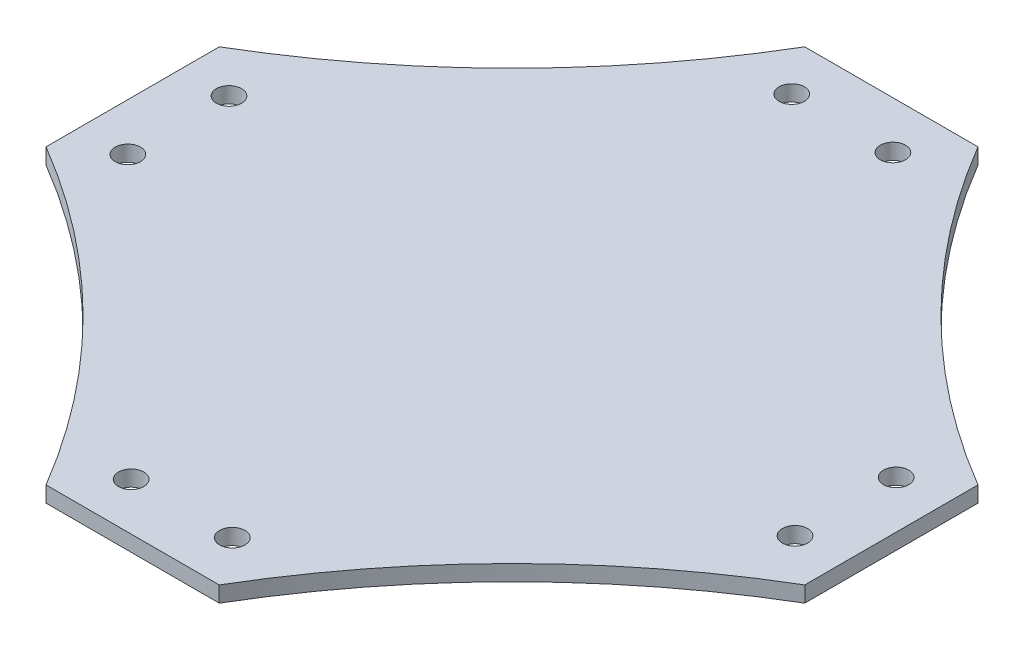
ISO-10303-21;
HEADER;
FILE_DESCRIPTION(('STEP AP214'),'2;1');
FILE_NAME('part.step','',(''),(''),'','','');
FILE_SCHEMA(('AUTOMOTIVE_DESIGN { 1 0 10303 214 1 1 1 1 }'));
ENDSEC;
DATA;
#1=APPLICATION_CONTEXT('core data for automotive mechanical design processes');
#2=APPLICATION_PROTOCOL_DEFINITION('international standard','automotive_design',2000,#1);
#3=PRODUCT_CONTEXT('',#1,'mechanical');
#4=PRODUCT('Part','Part','',(#3));
#5=PRODUCT_RELATED_PRODUCT_CATEGORY('part','',(#4));
#6=PRODUCT_DEFINITION_FORMATION('','',#4);
#7=PRODUCT_DEFINITION_CONTEXT('part definition',#1,'design');
#8=PRODUCT_DEFINITION('design','',#6,#7);
#9=PRODUCT_DEFINITION_SHAPE('','',#8);
#10=(LENGTH_UNIT() NAMED_UNIT(*) SI_UNIT(.MILLI.,.METRE.));
#11=(NAMED_UNIT(*) PLANE_ANGLE_UNIT() SI_UNIT($,.RADIAN.));
#12=(NAMED_UNIT(*) SI_UNIT($,.STERADIAN.) SOLID_ANGLE_UNIT());
#13=UNCERTAINTY_MEASURE_WITH_UNIT(LENGTH_MEASURE(1.E-05),#10,'distance_accuracy_value','');
#14=(GEOMETRIC_REPRESENTATION_CONTEXT(3) GLOBAL_UNCERTAINTY_ASSIGNED_CONTEXT((#13)) GLOBAL_UNIT_ASSIGNED_CONTEXT((#10,
#11,#12)) REPRESENTATION_CONTEXT('',''));
#15=CARTESIAN_POINT('',(0.,0.,0.));
#16=DIRECTION('',(0.,0.,1.));
#17=DIRECTION('',(1.,0.,0.));
#18=AXIS2_PLACEMENT_3D('',#15,#16,#17);
#19=CARTESIAN_POINT('',(126.747724256716,2.5,-126.747724256714));
#20=DIRECTION('',(0.,-1.,0.));
#21=DIRECTION('',(0.,0.,-1.));
#22=AXIS2_PLACEMENT_3D('',#19,#20,#21);
#23=CYLINDRICAL_SURFACE('',#22,131.282316604609);
#24=CARTESIAN_POINT('',(126.747724256716,0.,-126.747724256714));
#25=DIRECTION('',(0.,-1.,0.));
#26=DIRECTION('',(0.,0.,-1.));
#27=AXIS2_PLACEMENT_3D('',#24,#25,#26);
#28=CIRCLE('',#27,131.282316604609);
#29=CARTESIAN_POINT('',(60.,0.,-13.6999999999998));
#30=VERTEX_POINT('',#29);
#31=CARTESIAN_POINT('',(13.7,0.,-60.));
#32=VERTEX_POINT('',#31);
#33=EDGE_CURVE('E133',#30,#32,#28,.T.);
#34=ORIENTED_EDGE('',*,*,#33,.T.);
#35=DIRECTION('',(0.,-1.,0.));
#36=VECTOR('',#35,1.);
#37=CARTESIAN_POINT('',(13.7,2.5,-60.));
#38=LINE('',#37,#36);
#39=CARTESIAN_POINT('',(13.7,2.5,-60.));
#40=VERTEX_POINT('',#39);
#41=EDGE_CURVE('E11',#40,#32,#38,.T.);
#42=ORIENTED_EDGE('',*,*,#41,.F.);
#43=CARTESIAN_POINT('',(126.747724256716,2.5,-126.747724256714));
#44=DIRECTION('',(0.,-1.,0.));
#45=DIRECTION('',(0.,0.,-1.));
#46=AXIS2_PLACEMENT_3D('',#43,#44,#45);
#47=CIRCLE('',#46,131.282316604609);
#48=CARTESIAN_POINT('',(60.,2.5,-13.6999999999998));
#49=VERTEX_POINT('',#48);
#50=EDGE_CURVE('E148',#49,#40,#47,.T.);
#51=ORIENTED_EDGE('',*,*,#50,.F.);
#52=DIRECTION('',(0.,-1.,0.));
#53=VECTOR('',#52,1.);
#54=CARTESIAN_POINT('',(60.,2.5,-13.6999999999998));
#55=LINE('',#54,#53);
#56=EDGE_CURVE('E129',#49,#30,#55,.T.);
#57=ORIENTED_EDGE('',*,*,#56,.T.);
#58=EDGE_LOOP('',(#34,#42,#51,#57));
#59=FACE_BOUND('',#58,.T.);
#60=ADVANCED_FACE('F37',(#59),#23,.F.);
#61=CARTESIAN_POINT('',(-13.7,2.5,-60.));
#62=DIRECTION('',(0.,0.,1.));
#63=DIRECTION('',(1.,0.,0.));
#64=AXIS2_PLACEMENT_3D('',#61,#62,#63);
#65=PLANE('',#64);
#66=DIRECTION('',(-1.,0.,0.));
#67=VECTOR('',#66,1.);
#68=CARTESIAN_POINT('',(-13.7,0.,-60.));
#69=LINE('',#68,#67);
#70=CARTESIAN_POINT('',(-13.7,0.,-60.));
#71=VERTEX_POINT('',#70);
#72=EDGE_CURVE('E136',#32,#71,#69,.T.);
#73=ORIENTED_EDGE('',*,*,#72,.T.);
#74=DIRECTION('',(0.,-1.,0.));
#75=VECTOR('',#74,1.);
#76=CARTESIAN_POINT('',(-13.7,2.5,-60.));
#77=LINE('',#76,#75);
#78=CARTESIAN_POINT('',(-13.7,2.5,-60.));
#79=VERTEX_POINT('',#78);
#80=EDGE_CURVE('E45',#79,#71,#77,.T.);
#81=ORIENTED_EDGE('',*,*,#80,.F.);
#82=DIRECTION('',(-1.,0.,0.));
#83=VECTOR('',#82,1.);
#84=CARTESIAN_POINT('',(-13.7,2.5,-60.));
#85=LINE('',#84,#83);
#86=EDGE_CURVE('E96',#40,#79,#85,.T.);
#87=ORIENTED_EDGE('',*,*,#86,.F.);
#88=ORIENTED_EDGE('',*,*,#41,.T.);
#89=EDGE_LOOP('',(#73,#81,#87,#88));
#90=FACE_BOUND('',#89,.T.);
#91=ADVANCED_FACE('F265',(#90),#65,.F.);
#92=CARTESIAN_POINT('',(-126.747724256714,2.5,-126.747724256716));
#93=DIRECTION('',(0.,-1.,0.));
#94=DIRECTION('',(0.,0.,-1.));
#95=AXIS2_PLACEMENT_3D('',#92,#93,#94);
#96=CYLINDRICAL_SURFACE('',#95,131.282316604609);
#97=CARTESIAN_POINT('',(-126.747724256714,0.,-126.747724256716));
#98=DIRECTION('',(0.,-1.,0.));
#99=DIRECTION('',(0.,0.,-1.));
#100=AXIS2_PLACEMENT_3D('',#97,#98,#99);
#101=CIRCLE('',#100,131.282316604609);
#102=CARTESIAN_POINT('',(-59.9999999999999,0.,-13.7000000000006));
#103=VERTEX_POINT('',#102);
#104=EDGE_CURVE('E139',#71,#103,#101,.T.);
#105=ORIENTED_EDGE('',*,*,#104,.T.);
#106=DIRECTION('',(0.,-1.,0.));
#107=VECTOR('',#106,1.);
#108=CARTESIAN_POINT('',(-59.9999999999999,2.5,-13.7000000000006));
#109=LINE('',#108,#107);
#110=CARTESIAN_POINT('',(-59.9999999999999,2.5,-13.7000000000006));
#111=VERTEX_POINT('',#110);
#112=EDGE_CURVE('E155',#111,#103,#109,.T.);
#113=ORIENTED_EDGE('',*,*,#112,.F.);
#114=CARTESIAN_POINT('',(-126.747724256714,2.5,-126.747724256716));
#115=DIRECTION('',(0.,-1.,0.));
#116=DIRECTION('',(0.,0.,-1.));
#117=AXIS2_PLACEMENT_3D('',#114,#115,#116);
#118=CIRCLE('',#117,131.282316604609);
#119=EDGE_CURVE('E163',#79,#111,#118,.T.);
#120=ORIENTED_EDGE('',*,*,#119,.F.);
#121=ORIENTED_EDGE('',*,*,#80,.T.);
#122=EDGE_LOOP('',(#105,#113,#120,#121));
#123=FACE_BOUND('',#122,.T.);
#124=ADVANCED_FACE('F161',(#123),#96,.F.);
#125=CARTESIAN_POINT('',(-60.0000000000002,2.5,13.6999999999994));
#126=DIRECTION('',(1.,0.,0.));
#127=DIRECTION('',(0.,0.,-1.));
#128=AXIS2_PLACEMENT_3D('',#125,#126,#127);
#129=PLANE('',#128);
#130=DIRECTION('',(0.,0.,1.));
#131=VECTOR('',#130,1.);
#132=CARTESIAN_POINT('',(-60.0000000000002,0.,13.6999999999994));
#133=LINE('',#132,#131);
#134=CARTESIAN_POINT('',(-60.0000000000002,0.,13.6999999999994));
#135=VERTEX_POINT('',#134);
#136=EDGE_CURVE('E141',#103,#135,#133,.T.);
#137=ORIENTED_EDGE('',*,*,#136,.T.);
#138=DIRECTION('',(0.,-1.,0.));
#139=VECTOR('',#138,1.);
#140=CARTESIAN_POINT('',(-60.0000000000002,2.5,13.6999999999994));
#141=LINE('',#140,#139);
#142=CARTESIAN_POINT('',(-60.0000000000002,2.5,13.6999999999994));
#143=VERTEX_POINT('',#142);
#144=EDGE_CURVE('E152',#143,#135,#141,.T.);
#145=ORIENTED_EDGE('',*,*,#144,.F.);
#146=DIRECTION('',(0.,0.,1.));
#147=VECTOR('',#146,1.);
#148=CARTESIAN_POINT('',(-60.0000000000002,2.5,13.6999999999994));
#149=LINE('',#148,#147);
#150=EDGE_CURVE('E175',#111,#143,#149,.T.);
#151=ORIENTED_EDGE('',*,*,#150,.F.);
#152=ORIENTED_EDGE('',*,*,#112,.T.);
#153=EDGE_LOOP('',(#137,#145,#151,#152));
#154=FACE_BOUND('',#153,.T.);
#155=ADVANCED_FACE('F171',(#154),#129,.F.);
#156=CARTESIAN_POINT('',(-126.747724256717,2.5,126.747724256713));
#157=DIRECTION('',(0.,-1.,0.));
#158=DIRECTION('',(0.,0.,-1.));
#159=AXIS2_PLACEMENT_3D('',#156,#157,#158);
#160=CYLINDRICAL_SURFACE('',#159,131.282316604609);
#161=CARTESIAN_POINT('',(-126.747724256717,0.,126.747724256713));
#162=DIRECTION('',(0.,-1.,0.));
#163=DIRECTION('',(0.,0.,-1.));
#164=AXIS2_PLACEMENT_3D('',#161,#162,#163);
#165=CIRCLE('',#164,131.282316604609);
#166=CARTESIAN_POINT('',(-13.7000000000007,0.,60.0000000000001));
#167=VERTEX_POINT('',#166);
#168=EDGE_CURVE('E143',#135,#167,#165,.T.);
#169=ORIENTED_EDGE('',*,*,#168,.T.);
#170=DIRECTION('',(0.,-1.,0.));
#171=VECTOR('',#170,1.);
#172=CARTESIAN_POINT('',(-13.7000000000007,2.5,60.0000000000001));
#173=LINE('',#172,#171);
#174=CARTESIAN_POINT('',(-13.7000000000007,2.5,60.0000000000001));
#175=VERTEX_POINT('',#174);
#176=EDGE_CURVE('E124',#175,#167,#173,.T.);
#177=ORIENTED_EDGE('',*,*,#176,.F.);
#178=CARTESIAN_POINT('',(-126.747724256717,2.5,126.747724256713));
#179=DIRECTION('',(0.,-1.,0.));
#180=DIRECTION('',(0.,0.,-1.));
#181=AXIS2_PLACEMENT_3D('',#178,#179,#180);
#182=CIRCLE('',#181,131.282316604609);
#183=EDGE_CURVE('E115',#143,#175,#182,.T.);
#184=ORIENTED_EDGE('',*,*,#183,.F.);
#185=ORIENTED_EDGE('',*,*,#144,.T.);
#186=EDGE_LOOP('',(#169,#177,#184,#185));
#187=FACE_BOUND('',#186,.T.);
#188=ADVANCED_FACE('F174',(#187),#160,.F.);
#189=CARTESIAN_POINT('',(13.6999999999996,2.5,60.0000000000001));
#190=DIRECTION('',(0.,0.,-1.));
#191=DIRECTION('',(-1.,0.,0.));
#192=AXIS2_PLACEMENT_3D('',#189,#190,#191);
#193=PLANE('',#192);
#194=DIRECTION('',(1.,0.,0.));
#195=VECTOR('',#194,1.);
#196=CARTESIAN_POINT('',(13.6999999999996,0.,60.0000000000001));
#197=LINE('',#196,#195);
#198=CARTESIAN_POINT('',(13.6999999999996,0.,60.0000000000001));
#199=VERTEX_POINT('',#198);
#200=EDGE_CURVE('E123',#167,#199,#197,.T.);
#201=ORIENTED_EDGE('',*,*,#200,.T.);
#202=DIRECTION('',(0.,-1.,0.));
#203=VECTOR('',#202,1.);
#204=CARTESIAN_POINT('',(13.6999999999996,2.5,60.0000000000001));
#205=LINE('',#204,#203);
#206=CARTESIAN_POINT('',(13.6999999999996,2.5,60.0000000000001));
#207=VERTEX_POINT('',#206);
#208=EDGE_CURVE('E120',#207,#199,#205,.T.);
#209=ORIENTED_EDGE('',*,*,#208,.F.);
#210=DIRECTION('',(1.,0.,0.));
#211=VECTOR('',#210,1.);
#212=CARTESIAN_POINT('',(13.6999999999996,2.5,60.0000000000001));
#213=LINE('',#212,#211);
#214=EDGE_CURVE('E109',#175,#207,#213,.T.);
#215=ORIENTED_EDGE('',*,*,#214,.F.);
#216=ORIENTED_EDGE('',*,*,#176,.T.);
#217=EDGE_LOOP('',(#201,#209,#215,#216));
#218=FACE_BOUND('',#217,.T.);
#219=ADVANCED_FACE('F121',(#218),#193,.F.);
#220=CARTESIAN_POINT('',(126.747724256714,2.5,126.747724256717));
#221=DIRECTION('',(0.,-1.,0.));
#222=DIRECTION('',(0.,0.,-1.));
#223=AXIS2_PLACEMENT_3D('',#220,#221,#222);
#224=CYLINDRICAL_SURFACE('',#223,131.282316604609);
#225=CARTESIAN_POINT('',(126.747724256714,0.,126.747724256717));
#226=DIRECTION('',(0.,-1.,0.));
#227=DIRECTION('',(0.,0.,-1.));
#228=AXIS2_PLACEMENT_3D('',#225,#226,#227);
#229=CIRCLE('',#228,131.282316604609);
#230=CARTESIAN_POINT('',(60.0000000000001,0.,13.7000000000004));
#231=VERTEX_POINT('',#230);
#232=EDGE_CURVE('E82',#199,#231,#229,.T.);
#233=ORIENTED_EDGE('',*,*,#232,.T.);
#234=DIRECTION('',(0.,-1.,0.));
#235=VECTOR('',#234,1.);
#236=CARTESIAN_POINT('',(60.0000000000001,2.5,13.7000000000004));
#237=LINE('',#236,#235);
#238=CARTESIAN_POINT('',(60.0000000000001,2.5,13.7000000000004));
#239=VERTEX_POINT('',#238);
#240=EDGE_CURVE('E125',#239,#231,#237,.T.);
#241=ORIENTED_EDGE('',*,*,#240,.F.);
#242=CARTESIAN_POINT('',(126.747724256714,2.5,126.747724256717));
#243=DIRECTION('',(0.,-1.,0.));
#244=DIRECTION('',(0.,0.,-1.));
#245=AXIS2_PLACEMENT_3D('',#242,#243,#244);
#246=CIRCLE('',#245,131.282316604609);
#247=EDGE_CURVE('E113',#207,#239,#246,.T.);
#248=ORIENTED_EDGE('',*,*,#247,.F.);
#249=ORIENTED_EDGE('',*,*,#208,.T.);
#250=EDGE_LOOP('',(#233,#241,#248,#249));
#251=FACE_BOUND('',#250,.T.);
#252=ADVANCED_FACE('F127',(#251),#224,.F.);
#253=CARTESIAN_POINT('',(60.,2.5,-13.6999999999998));
#254=DIRECTION('',(-1.,0.,0.));
#255=DIRECTION('',(0.,0.,1.));
#256=AXIS2_PLACEMENT_3D('',#253,#254,#255);
#257=PLANE('',#256);
#258=DIRECTION('',(0.,0.,-1.));
#259=VECTOR('',#258,1.);
#260=CARTESIAN_POINT('',(60.,0.,-13.6999999999998));
#261=LINE('',#260,#259);
#262=EDGE_CURVE('E88',#231,#30,#261,.T.);
#263=ORIENTED_EDGE('',*,*,#262,.T.);
#264=ORIENTED_EDGE('',*,*,#56,.F.);
#265=DIRECTION('',(0.,0.,-1.));
#266=VECTOR('',#265,1.);
#267=CARTESIAN_POINT('',(60.,2.5,-13.6999999999998));
#268=LINE('',#267,#266);
#269=EDGE_CURVE('E53',#239,#49,#268,.T.);
#270=ORIENTED_EDGE('',*,*,#269,.F.);
#271=ORIENTED_EDGE('',*,*,#240,.T.);
#272=EDGE_LOOP('',(#263,#264,#270,#271));
#273=FACE_BOUND('',#272,.T.);
#274=ADVANCED_FACE('F241',(#273),#257,.F.);
#275=CARTESIAN_POINT('',(126.747724256716,2.5,-126.747724256714));
#276=DIRECTION('',(0.,-1.,0.));
#277=DIRECTION('',(0.,0.,-1.));
#278=AXIS2_PLACEMENT_3D('',#275,#276,#277);
#279=PLANE('',#278);
#280=CARTESIAN_POINT('',(52.4999999999999,2.5,-8.25971662402286));
#281=DIRECTION('',(0.,1.,0.));
#282=DIRECTION('',(-1.,0.,0.));
#283=AXIS2_PLACEMENT_3D('',#280,#281,#282);
#284=CIRCLE('',#283,2.);
#285=CARTESIAN_POINT('',(50.4999999999999,2.5,-8.25971662402284));
#286=VERTEX_POINT('',#285);
#287=EDGE_CURVE('E211',#286,#286,#284,.T.);
#288=ORIENTED_EDGE('',*,*,#287,.F.);
#289=EDGE_LOOP('',(#288));
#290=FACE_BOUND('',#289,.T.);
#291=CARTESIAN_POINT('',(-7.74028337597769,2.5,52.5));
#292=DIRECTION('',(0.,1.,0.));
#293=DIRECTION('',(0.,0.,-1.));
#294=AXIS2_PLACEMENT_3D('',#291,#292,#293);
#295=CIRCLE('',#294,2.);
#296=CARTESIAN_POINT('',(-7.74028337597769,2.5,50.5));
#297=VERTEX_POINT('',#296);
#298=EDGE_CURVE('E218',#297,#297,#295,.T.);
#299=ORIENTED_EDGE('',*,*,#298,.F.);
#300=EDGE_LOOP('',(#299));
#301=FACE_BOUND('',#300,.T.);
#302=CARTESIAN_POINT('',(8.25971662402231,2.5,52.5));
#303=DIRECTION('',(0.,1.,0.));
#304=DIRECTION('',(0.,0.,-1.));
#305=AXIS2_PLACEMENT_3D('',#302,#303,#304);
#306=CIRCLE('',#305,2.);
#307=CARTESIAN_POINT('',(8.25971662402231,2.5,50.5));
#308=VERTEX_POINT('',#307);
#309=EDGE_CURVE('E199',#308,#308,#306,.T.);
#310=ORIENTED_EDGE('',*,*,#309,.F.);
#311=EDGE_LOOP('',(#310));
#312=FACE_BOUND('',#311,.T.);
#313=CARTESIAN_POINT('',(-52.5,2.5,-7.74028337597751));
#314=DIRECTION('',(0.,1.,0.));
#315=DIRECTION('',(1.,0.,0.));
#316=AXIS2_PLACEMENT_3D('',#313,#314,#315);
#317=CIRCLE('',#316,2.);
#318=CARTESIAN_POINT('',(-50.5,2.5,-7.74028337597752));
#319=VERTEX_POINT('',#318);
#320=EDGE_CURVE('E206',#319,#319,#317,.T.);
#321=ORIENTED_EDGE('',*,*,#320,.F.);
#322=EDGE_LOOP('',(#321));
#323=FACE_BOUND('',#322,.T.);
#324=CARTESIAN_POINT('',(52.5000000000001,2.5,7.74028337597714));
#325=DIRECTION('',(0.,1.,0.));
#326=DIRECTION('',(-1.,0.,0.));
#327=AXIS2_PLACEMENT_3D('',#324,#325,#326);
#328=CIRCLE('',#327,2.);
#329=CARTESIAN_POINT('',(50.5000000000001,2.5,7.74028337597716));
#330=VERTEX_POINT('',#329);
#331=EDGE_CURVE('E223',#330,#330,#328,.T.);
#332=ORIENTED_EDGE('',*,*,#331,.F.);
#333=EDGE_LOOP('',(#332));
#334=FACE_BOUND('',#333,.T.);
#335=CARTESIAN_POINT('',(-52.5,2.5,8.25971662402249));
#336=DIRECTION('',(0.,1.,0.));
#337=DIRECTION('',(1.,0.,0.));
#338=AXIS2_PLACEMENT_3D('',#335,#336,#337);
#339=CIRCLE('',#338,2.);
#340=CARTESIAN_POINT('',(-50.5,2.5,8.25971662402248));
#341=VERTEX_POINT('',#340);
#342=EDGE_CURVE('E193',#341,#341,#339,.T.);
#343=ORIENTED_EDGE('',*,*,#342,.F.);
#344=EDGE_LOOP('',(#343));
#345=FACE_BOUND('',#344,.T.);
#346=CARTESIAN_POINT('',(-8.25971662402231,2.5,-52.5));
#347=DIRECTION('',(0.,1.,0.));
#348=DIRECTION('',(0.,0.,1.));
#349=AXIS2_PLACEMENT_3D('',#346,#347,#348);
#350=CIRCLE('',#349,2.);
#351=CARTESIAN_POINT('',(-8.25971662402231,2.5,-50.5));
#352=VERTEX_POINT('',#351);
#353=EDGE_CURVE('E188',#352,#352,#350,.T.);
#354=ORIENTED_EDGE('',*,*,#353,.F.);
#355=EDGE_LOOP('',(#354));
#356=FACE_BOUND('',#355,.T.);
#357=CARTESIAN_POINT('',(7.74028337597769,2.5,-52.5));
#358=DIRECTION('',(0.,1.,0.));
#359=DIRECTION('',(0.,0.,1.));
#360=AXIS2_PLACEMENT_3D('',#357,#358,#359);
#361=CIRCLE('',#360,2.);
#362=CARTESIAN_POINT('',(7.74028337597769,2.5,-50.5));
#363=VERTEX_POINT('',#362);
#364=EDGE_CURVE('E181',#363,#363,#361,.T.);
#365=ORIENTED_EDGE('',*,*,#364,.F.);
#366=EDGE_LOOP('',(#365));
#367=FACE_BOUND('',#366,.T.);
#368=ORIENTED_EDGE('',*,*,#50,.T.);
#369=ORIENTED_EDGE('',*,*,#86,.T.);
#370=ORIENTED_EDGE('',*,*,#119,.T.);
#371=ORIENTED_EDGE('',*,*,#150,.T.);
#372=ORIENTED_EDGE('',*,*,#183,.T.);
#373=ORIENTED_EDGE('',*,*,#214,.T.);
#374=ORIENTED_EDGE('',*,*,#247,.T.);
#375=ORIENTED_EDGE('',*,*,#269,.T.);
#376=EDGE_LOOP('',(#368,#369,#370,#371,#372,#373,#374,#375));
#377=FACE_BOUND('',#376,.T.);
#378=ADVANCED_FACE('F111',(#290,#301,#312,#323,#334,#345,#356,#367,#377),#279,.F.);
#379=CARTESIAN_POINT('',(126.747724256716,0.,-126.747724256714));
#380=DIRECTION('',(0.,-1.,0.));
#381=DIRECTION('',(0.,0.,-1.));
#382=AXIS2_PLACEMENT_3D('',#379,#380,#381);
#383=PLANE('',#382);
#384=CARTESIAN_POINT('',(52.4999999999999,0.,-8.25971662402286));
#385=DIRECTION('',(0.,1.,0.));
#386=DIRECTION('',(-1.,0.,0.));
#387=AXIS2_PLACEMENT_3D('',#384,#385,#386);
#388=CIRCLE('',#387,2.);
#389=CARTESIAN_POINT('',(50.4999999999999,0.,-8.25971662402284));
#390=VERTEX_POINT('',#389);
#391=EDGE_CURVE('E214',#390,#390,#388,.T.);
#392=ORIENTED_EDGE('',*,*,#391,.T.);
#393=EDGE_LOOP('',(#392));
#394=FACE_BOUND('',#393,.T.);
#395=CARTESIAN_POINT('',(-7.74028337597769,0.,52.5));
#396=DIRECTION('',(0.,1.,0.));
#397=DIRECTION('',(0.,0.,-1.));
#398=AXIS2_PLACEMENT_3D('',#395,#396,#397);
#399=CIRCLE('',#398,2.);
#400=CARTESIAN_POINT('',(-7.74028337597769,0.,50.5));
#401=VERTEX_POINT('',#400);
#402=EDGE_CURVE('E203',#401,#401,#399,.T.);
#403=ORIENTED_EDGE('',*,*,#402,.T.);
#404=EDGE_LOOP('',(#403));
#405=FACE_BOUND('',#404,.T.);
#406=CARTESIAN_POINT('',(8.25971662402231,0.,52.5));
#407=DIRECTION('',(0.,1.,0.));
#408=DIRECTION('',(0.,0.,-1.));
#409=AXIS2_PLACEMENT_3D('',#406,#407,#408);
#410=CIRCLE('',#409,2.);
#411=CARTESIAN_POINT('',(8.25971662402231,0.,50.5));
#412=VERTEX_POINT('',#411);
#413=EDGE_CURVE('E202',#412,#412,#410,.T.);
#414=ORIENTED_EDGE('',*,*,#413,.T.);
#415=EDGE_LOOP('',(#414));
#416=FACE_BOUND('',#415,.T.);
#417=CARTESIAN_POINT('',(-52.5,0.,-7.74028337597751));
#418=DIRECTION('',(0.,1.,0.));
#419=DIRECTION('',(1.,0.,0.));
#420=AXIS2_PLACEMENT_3D('',#417,#418,#419);
#421=CIRCLE('',#420,2.);
#422=CARTESIAN_POINT('',(-50.5,0.,-7.74028337597752));
#423=VERTEX_POINT('',#422);
#424=EDGE_CURVE('E196',#423,#423,#421,.T.);
#425=ORIENTED_EDGE('',*,*,#424,.T.);
#426=EDGE_LOOP('',(#425));
#427=FACE_BOUND('',#426,.T.);
#428=CARTESIAN_POINT('',(52.5000000000001,0.,7.74028337597714));
#429=DIRECTION('',(0.,1.,0.));
#430=DIRECTION('',(-1.,0.,0.));
#431=AXIS2_PLACEMENT_3D('',#428,#429,#430);
#432=CIRCLE('',#431,2.);
#433=CARTESIAN_POINT('',(50.5000000000001,0.,7.74028337597716));
#434=VERTEX_POINT('',#433);
#435=EDGE_CURVE('E215',#434,#434,#432,.T.);
#436=ORIENTED_EDGE('',*,*,#435,.T.);
#437=EDGE_LOOP('',(#436));
#438=FACE_BOUND('',#437,.T.);
#439=CARTESIAN_POINT('',(-52.5,0.,8.25971662402249));
#440=DIRECTION('',(0.,1.,0.));
#441=DIRECTION('',(1.,0.,0.));
#442=AXIS2_PLACEMENT_3D('',#439,#440,#441);
#443=CIRCLE('',#442,2.);
#444=CARTESIAN_POINT('',(-50.5,0.,8.25971662402248));
#445=VERTEX_POINT('',#444);
#446=EDGE_CURVE('E185',#445,#445,#443,.T.);
#447=ORIENTED_EDGE('',*,*,#446,.T.);
#448=EDGE_LOOP('',(#447));
#449=FACE_BOUND('',#448,.T.);
#450=CARTESIAN_POINT('',(-8.25971662402231,0.,-52.5));
#451=DIRECTION('',(0.,1.,0.));
#452=DIRECTION('',(0.,0.,1.));
#453=AXIS2_PLACEMENT_3D('',#450,#451,#452);
#454=CIRCLE('',#453,2.);
#455=CARTESIAN_POINT('',(-8.25971662402231,0.,-50.5));
#456=VERTEX_POINT('',#455);
#457=EDGE_CURVE('E137',#456,#456,#454,.T.);
#458=ORIENTED_EDGE('',*,*,#457,.T.);
#459=EDGE_LOOP('',(#458));
#460=FACE_BOUND('',#459,.T.);
#461=CARTESIAN_POINT('',(7.74028337597769,0.,-52.5));
#462=DIRECTION('',(0.,1.,0.));
#463=DIRECTION('',(0.,0.,1.));
#464=AXIS2_PLACEMENT_3D('',#461,#462,#463);
#465=CIRCLE('',#464,2.);
#466=CARTESIAN_POINT('',(7.74028337597769,0.,-50.5));
#467=VERTEX_POINT('',#466);
#468=EDGE_CURVE('E184',#467,#467,#465,.T.);
#469=ORIENTED_EDGE('',*,*,#468,.T.);
#470=EDGE_LOOP('',(#469));
#471=FACE_BOUND('',#470,.T.);
#472=ORIENTED_EDGE('',*,*,#33,.F.);
#473=ORIENTED_EDGE('',*,*,#262,.F.);
#474=ORIENTED_EDGE('',*,*,#232,.F.);
#475=ORIENTED_EDGE('',*,*,#200,.F.);
#476=ORIENTED_EDGE('',*,*,#168,.F.);
#477=ORIENTED_EDGE('',*,*,#136,.F.);
#478=ORIENTED_EDGE('',*,*,#104,.F.);
#479=ORIENTED_EDGE('',*,*,#72,.F.);
#480=EDGE_LOOP('',(#472,#473,#474,#475,#476,#477,#478,#479));
#481=FACE_BOUND('',#480,.T.);
#482=ADVANCED_FACE('F167',(#394,#405,#416,#427,#438,#449,#460,#471,#481),#383,.T.);
#483=CARTESIAN_POINT('',(7.74028337597769,0.,-52.5));
#484=DIRECTION('',(0.,1.,0.));
#485=DIRECTION('',(0.,0.,1.));
#486=AXIS2_PLACEMENT_3D('',#483,#484,#485);
#487=CYLINDRICAL_SURFACE('',#486,2.);
#488=ORIENTED_EDGE('',*,*,#468,.F.);
#489=EDGE_LOOP('',(#488));
#490=FACE_BOUND('',#489,.T.);
#491=ORIENTED_EDGE('',*,*,#364,.T.);
#492=EDGE_LOOP('',(#491));
#493=FACE_BOUND('',#492,.T.);
#494=ADVANCED_FACE('F250',(#490,#493),#487,.F.);
#495=CARTESIAN_POINT('',(-8.25971662402231,0.,-52.5));
#496=DIRECTION('',(0.,1.,0.));
#497=DIRECTION('',(0.,0.,1.));
#498=AXIS2_PLACEMENT_3D('',#495,#496,#497);
#499=CYLINDRICAL_SURFACE('',#498,2.);
#500=ORIENTED_EDGE('',*,*,#457,.F.);
#501=EDGE_LOOP('',(#500));
#502=FACE_BOUND('',#501,.T.);
#503=ORIENTED_EDGE('',*,*,#353,.T.);
#504=EDGE_LOOP('',(#503));
#505=FACE_BOUND('',#504,.T.);
#506=ADVANCED_FACE('F252',(#502,#505),#499,.F.);
#507=CARTESIAN_POINT('',(-52.5,0.,8.25971662402249));
#508=DIRECTION('',(0.,1.,0.));
#509=DIRECTION('',(0.,0.,1.));
#510=AXIS2_PLACEMENT_3D('',#507,#508,#509);
#511=CYLINDRICAL_SURFACE('',#510,2.);
#512=ORIENTED_EDGE('',*,*,#446,.F.);
#513=EDGE_LOOP('',(#512));
#514=FACE_BOUND('',#513,.T.);
#515=ORIENTED_EDGE('',*,*,#342,.T.);
#516=EDGE_LOOP('',(#515));
#517=FACE_BOUND('',#516,.T.);
#518=ADVANCED_FACE('F235',(#514,#517),#511,.F.);
#519=CARTESIAN_POINT('',(52.5000000000001,0.,7.74028337597714));
#520=DIRECTION('',(0.,1.,0.));
#521=DIRECTION('',(0.,0.,1.));
#522=AXIS2_PLACEMENT_3D('',#519,#520,#521);
#523=CYLINDRICAL_SURFACE('',#522,2.);
#524=ORIENTED_EDGE('',*,*,#435,.F.);
#525=EDGE_LOOP('',(#524));
#526=FACE_BOUND('',#525,.T.);
#527=ORIENTED_EDGE('',*,*,#331,.T.);
#528=EDGE_LOOP('',(#527));
#529=FACE_BOUND('',#528,.T.);
#530=ADVANCED_FACE('F231',(#526,#529),#523,.F.);
#531=CARTESIAN_POINT('',(-52.5,0.,-7.74028337597751));
#532=DIRECTION('',(0.,1.,0.));
#533=DIRECTION('',(0.,0.,1.));
#534=AXIS2_PLACEMENT_3D('',#531,#532,#533);
#535=CYLINDRICAL_SURFACE('',#534,2.);
#536=ORIENTED_EDGE('',*,*,#424,.F.);
#537=EDGE_LOOP('',(#536));
#538=FACE_BOUND('',#537,.T.);
#539=ORIENTED_EDGE('',*,*,#320,.T.);
#540=EDGE_LOOP('',(#539));
#541=FACE_BOUND('',#540,.T.);
#542=ADVANCED_FACE('F234',(#538,#541),#535,.F.);
#543=CARTESIAN_POINT('',(8.25971662402231,0.,52.5));
#544=DIRECTION('',(0.,1.,0.));
#545=DIRECTION('',(0.,0.,1.));
#546=AXIS2_PLACEMENT_3D('',#543,#544,#545);
#547=CYLINDRICAL_SURFACE('',#546,2.);
#548=ORIENTED_EDGE('',*,*,#413,.F.);
#549=EDGE_LOOP('',(#548));
#550=FACE_BOUND('',#549,.T.);
#551=ORIENTED_EDGE('',*,*,#309,.T.);
#552=EDGE_LOOP('',(#551));
#553=FACE_BOUND('',#552,.T.);
#554=ADVANCED_FACE('F356',(#550,#553),#547,.F.);
#555=CARTESIAN_POINT('',(-7.74028337597769,0.,52.5));
#556=DIRECTION('',(0.,1.,0.));
#557=DIRECTION('',(0.,0.,1.));
#558=AXIS2_PLACEMENT_3D('',#555,#556,#557);
#559=CYLINDRICAL_SURFACE('',#558,2.);
#560=ORIENTED_EDGE('',*,*,#402,.F.);
#561=EDGE_LOOP('',(#560));
#562=FACE_BOUND('',#561,.T.);
#563=ORIENTED_EDGE('',*,*,#298,.T.);
#564=EDGE_LOOP('',(#563));
#565=FACE_BOUND('',#564,.T.);
#566=ADVANCED_FACE('F366',(#562,#565),#559,.F.);
#567=CARTESIAN_POINT('',(52.4999999999999,0.,-8.25971662402286));
#568=DIRECTION('',(0.,1.,0.));
#569=DIRECTION('',(0.,0.,1.));
#570=AXIS2_PLACEMENT_3D('',#567,#568,#569);
#571=CYLINDRICAL_SURFACE('',#570,2.);
#572=ORIENTED_EDGE('',*,*,#391,.F.);
#573=EDGE_LOOP('',(#572));
#574=FACE_BOUND('',#573,.T.);
#575=ORIENTED_EDGE('',*,*,#287,.T.);
#576=EDGE_LOOP('',(#575));
#577=FACE_BOUND('',#576,.T.);
#578=ADVANCED_FACE('F376',(#574,#577),#571,.F.);
#579=CLOSED_SHELL('',(#60,#91,#124,#155,#188,#219,#252,#274,#378,#482,#494,#506,#518,#530,#542,
#554,#566,#578));
#580=MANIFOLD_SOLID_BREP('B2',#579);
#581=ADVANCED_BREP_SHAPE_REPRESENTATION('',(#18,#580),#14);
#582=SHAPE_DEFINITION_REPRESENTATION(#9,#581);
ENDSEC;
END-ISO-10303-21;
